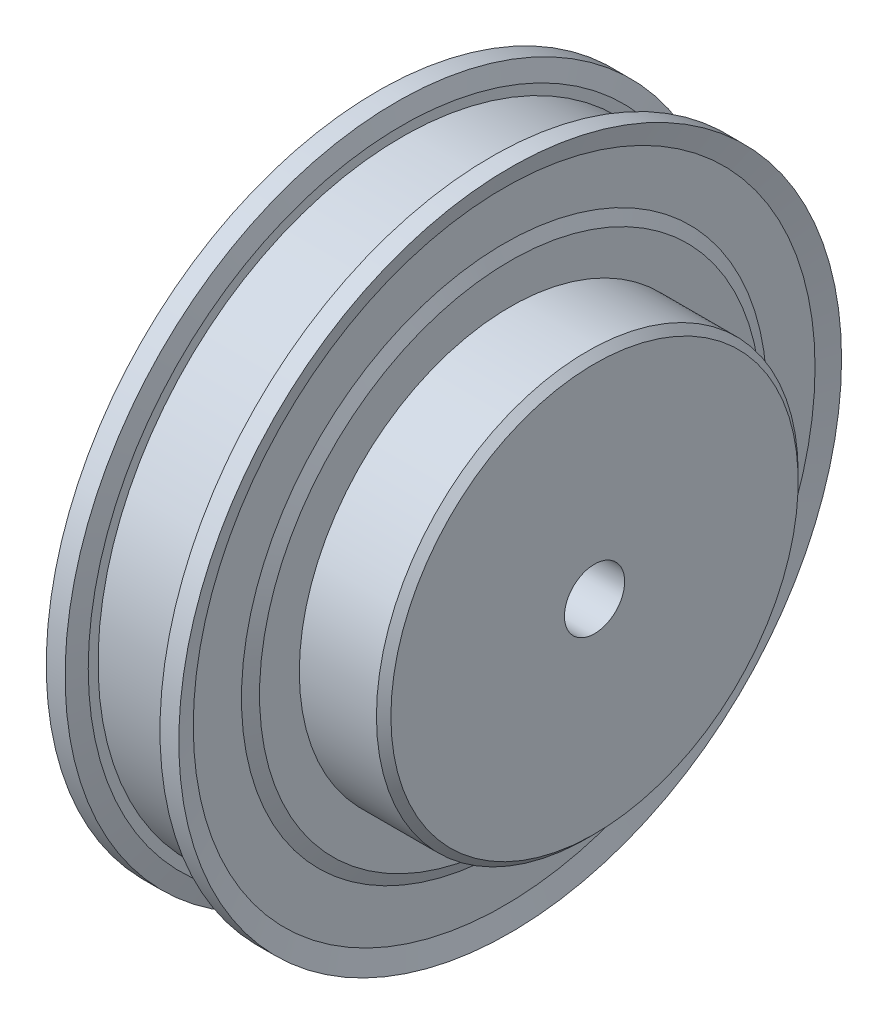
ISO-10303-21;
HEADER;
FILE_DESCRIPTION(('STEP AP214'),'2;1');
FILE_NAME('part.step','',(''),(''),'','','');
FILE_SCHEMA(('AUTOMOTIVE_DESIGN { 1 0 10303 214 1 1 1 1 }'));
ENDSEC;
DATA;
#1=APPLICATION_CONTEXT('core data for automotive mechanical design processes');
#2=APPLICATION_PROTOCOL_DEFINITION('international standard','automotive_design',2000,#1);
#3=PRODUCT_CONTEXT('',#1,'mechanical');
#4=PRODUCT('Part','Part','',(#3));
#5=PRODUCT_RELATED_PRODUCT_CATEGORY('part','',(#4));
#6=PRODUCT_DEFINITION_FORMATION('','',#4);
#7=PRODUCT_DEFINITION_CONTEXT('part definition',#1,'design');
#8=PRODUCT_DEFINITION('design','',#6,#7);
#9=PRODUCT_DEFINITION_SHAPE('','',#8);
#10=(LENGTH_UNIT() NAMED_UNIT(*) SI_UNIT(.MILLI.,.METRE.));
#11=(NAMED_UNIT(*) PLANE_ANGLE_UNIT() SI_UNIT($,.RADIAN.));
#12=(NAMED_UNIT(*) SI_UNIT($,.STERADIAN.) SOLID_ANGLE_UNIT());
#13=UNCERTAINTY_MEASURE_WITH_UNIT(LENGTH_MEASURE(1.E-05),#10,'distance_accuracy_value','');
#14=(GEOMETRIC_REPRESENTATION_CONTEXT(3) GLOBAL_UNCERTAINTY_ASSIGNED_CONTEXT((#13)) GLOBAL_UNIT_ASSIGNED_CONTEXT((#10,
#11,#12)) REPRESENTATION_CONTEXT('',''));
#15=CARTESIAN_POINT('',(0.,0.,0.));
#16=DIRECTION('',(0.,0.,1.));
#17=DIRECTION('',(1.,0.,0.));
#18=AXIS2_PLACEMENT_3D('',#15,#16,#17);
#19=CARTESIAN_POINT('',(5.65856270860032,0.8471223856294,132.089803738249));
#20=DIRECTION('',(-1.,0.,0.));
#21=DIRECTION('',(0.,0.,1.));
#22=AXIS2_PLACEMENT_3D('',#19,#20,#21);
#23=PLANE('',#22);
#24=CARTESIAN_POINT('',(5.65856270860058,0.847122385629351,110.289803738249));
#25=DIRECTION('',(-1.,0.,0.));
#26=DIRECTION('',(0.,0.,1.));
#27=AXIS2_PLACEMENT_3D('',#24,#25,#26);
#28=CIRCLE('',#27,21.8);
#29=CARTESIAN_POINT('',(5.65856270860085,0.847122385629303,88.4898037382492));
#30=VERTEX_POINT('',#29);
#31=EDGE_CURVE('E146',#30,#30,#28,.T.);
#32=ORIENTED_EDGE('',*,*,#31,.F.);
#33=EDGE_LOOP('',(#32));
#34=FACE_BOUND('',#33,.T.);
#35=CARTESIAN_POINT('',(5.65856270860063,0.847122385629351,110.289803738249));
#36=DIRECTION('',(-1.,0.,0.));
#37=DIRECTION('',(0.,0.,1.));
#38=AXIS2_PLACEMENT_3D('',#35,#36,#37);
#39=CIRCLE('',#38,25.8);
#40=CARTESIAN_POINT('',(5.65856270860095,0.847122385629294,84.4898037382493));
#41=VERTEX_POINT('',#40);
#42=EDGE_CURVE('E11',#41,#41,#39,.T.);
#43=ORIENTED_EDGE('',*,*,#42,.T.);
#44=EDGE_LOOP('',(#43));
#45=FACE_BOUND('',#44,.T.);
#46=ADVANCED_FACE('F17',(#34,#45),#23,.T.);
#47=CARTESIAN_POINT('',(5.40856270860064,0.847122385629351,110.289803738249));
#48=DIRECTION('',(-1.,0.,0.));
#49=DIRECTION('',(0.,0.,1.));
#50=AXIS2_PLACEMENT_3D('',#47,#48,#49);
#51=CONICAL_SURFACE('',#50,26.65,1.28474488507759);
#52=CARTESIAN_POINT('',(5.15856270860065,0.847122385629351,110.289803738249));
#53=DIRECTION('',(-1.,0.,0.));
#54=DIRECTION('',(0.,0.,1.));
#55=AXIS2_PLACEMENT_3D('',#52,#53,#54);
#56=CIRCLE('',#55,27.5);
#57=CARTESIAN_POINT('',(5.15856270860099,0.84712238562929,82.7898037382492));
#58=VERTEX_POINT('',#57);
#59=EDGE_CURVE('E147',#58,#58,#56,.T.);
#60=ORIENTED_EDGE('',*,*,#59,.T.);
#61=DIRECTION('',(0.282166323991525,0.,0.959365501571278));
#62=VECTOR('',#61,1.);
#63=CARTESIAN_POINT('',(5.40856270860097,0.847122385629292,83.6398037382492));
#64=LINE('',#63,#62);
#65=EDGE_CURVE('E28',#58,#41,#64,.T.);
#66=ORIENTED_EDGE('',*,*,#65,.T.);
#67=ORIENTED_EDGE('',*,*,#42,.F.);
#68=ORIENTED_EDGE('',*,*,#65,.F.);
#69=EDGE_LOOP('',(#60,#66,#67,#68));
#70=FACE_BOUND('',#69,.T.);
#71=ADVANCED_FACE('F321',(#70),#51,.F.);
#72=CARTESIAN_POINT('',(5.94032940624786,0.847122385629351,110.289803738249));
#73=DIRECTION('',(-1.,0.,0.));
#74=DIRECTION('',(0.,0.,1.));
#75=AXIS2_PLACEMENT_3D('',#72,#73,#74);
#76=CYLINDRICAL_SURFACE('',#75,27.5);
#77=ORIENTED_EDGE('',*,*,#59,.F.);
#78=DIRECTION('',(1.,0.,0.));
#79=VECTOR('',#78,1.);
#80=CARTESIAN_POINT('',(5.9403294062482,0.84712238562929,82.7898037382492));
#81=LINE('',#80,#79);
#82=CARTESIAN_POINT('',(6.72209610389541,0.84712238562929,82.7898037382492));
#83=VERTEX_POINT('',#82);
#84=EDGE_CURVE('E151',#58,#83,#81,.T.);
#85=ORIENTED_EDGE('',*,*,#84,.T.);
#86=CARTESIAN_POINT('',(6.72209610389507,0.847122385629351,110.289803738249));
#87=DIRECTION('',(-1.,0.,0.));
#88=DIRECTION('',(0.,0.,1.));
#89=AXIS2_PLACEMENT_3D('',#86,#87,#88);
#90=CIRCLE('',#89,27.5);
#91=EDGE_CURVE('E135',#83,#83,#90,.T.);
#92=ORIENTED_EDGE('',*,*,#91,.T.);
#93=ORIENTED_EDGE('',*,*,#84,.F.);
#94=EDGE_LOOP('',(#77,#85,#92,#93));
#95=FACE_BOUND('',#94,.T.);
#96=ADVANCED_FACE('F221',(#95),#76,.T.);
#97=CARTESIAN_POINT('',(6.94032940624787,0.847122385629351,110.289803738249));
#98=DIRECTION('',(-1.,0.,0.));
#99=DIRECTION('',(0.,0.,1.));
#100=AXIS2_PLACEMENT_3D('',#97,#98,#99);
#101=CONICAL_SURFACE('',#100,26.7580067720004,1.2847448850776);
#102=ORIENTED_EDGE('',*,*,#91,.F.);
#103=DIRECTION('',(0.282166323991517,0.,0.95936550157128));
#104=VECTOR('',#103,1.);
#105=CARTESIAN_POINT('',(6.9403294062482,0.847122385629292,83.5317969662488));
#106=LINE('',#105,#104);
#107=CARTESIAN_POINT('',(7.158562708601,0.847122385629293,84.2737901942485));
#108=VERTEX_POINT('',#107);
#109=EDGE_CURVE('E139',#83,#108,#106,.T.);
#110=ORIENTED_EDGE('',*,*,#109,.T.);
#111=CARTESIAN_POINT('',(7.15856270860068,0.847122385629351,110.289803738249));
#112=DIRECTION('',(-1.,0.,0.));
#113=DIRECTION('',(0.,0.,1.));
#114=AXIS2_PLACEMENT_3D('',#111,#112,#113);
#115=CIRCLE('',#114,26.0160135440008);
#116=EDGE_CURVE('E140',#108,#108,#115,.T.);
#117=ORIENTED_EDGE('',*,*,#116,.T.);
#118=ORIENTED_EDGE('',*,*,#109,.F.);
#119=EDGE_LOOP('',(#102,#110,#117,#118));
#120=FACE_BOUND('',#119,.T.);
#121=ADVANCED_FACE('F224',(#120),#101,.T.);
#122=CARTESIAN_POINT('',(7.15856270860036,0.8471223856294,136.30581728225));
#123=DIRECTION('',(1.,0.,0.));
#124=DIRECTION('',(0.,0.,1.));
#125=AXIS2_PLACEMENT_3D('',#122,#123,#124);
#126=PLANE('',#125);
#127=CARTESIAN_POINT('',(7.15856270860063,0.847122385629351,110.289803738249));
#128=DIRECTION('',(-1.,0.,0.));
#129=DIRECTION('',(0.,0.,1.));
#130=AXIS2_PLACEMENT_3D('',#127,#128,#129);
#131=CIRCLE('',#130,25.2);
#132=CARTESIAN_POINT('',(7.15856270860094,0.847122385629295,85.0898037382493));
#133=VERTEX_POINT('',#132);
#134=EDGE_CURVE('E177',#133,#133,#131,.T.);
#135=ORIENTED_EDGE('',*,*,#134,.T.);
#136=EDGE_LOOP('',(#135));
#137=FACE_BOUND('',#136,.T.);
#138=ORIENTED_EDGE('',*,*,#116,.F.);
#139=EDGE_LOOP('',(#138));
#140=FACE_BOUND('',#139,.T.);
#141=ADVANCED_FACE('F268',(#137,#140),#126,.T.);
#142=CARTESIAN_POINT('',(10.6585627086023,0.847122385629351,110.289803738249));
#143=DIRECTION('',(-1.,0.,0.));
#144=DIRECTION('',(0.,0.,1.));
#145=AXIS2_PLACEMENT_3D('',#142,#143,#144);
#146=CYLINDRICAL_SURFACE('',#145,25.2);
#147=ORIENTED_EDGE('',*,*,#134,.F.);
#148=DIRECTION('',(1.,0.,0.));
#149=VECTOR('',#148,1.);
#150=CARTESIAN_POINT('',(10.6585627086026,0.847122385629295,85.0898037382493));
#151=LINE('',#150,#149);
#152=CARTESIAN_POINT('',(14.1585627086042,0.847122385629295,85.0898037382494));
#153=VERTEX_POINT('',#152);
#154=EDGE_CURVE('E155',#133,#153,#151,.T.);
#155=ORIENTED_EDGE('',*,*,#154,.T.);
#156=CARTESIAN_POINT('',(14.1585627086039,0.847122385629351,110.289803738249));
#157=DIRECTION('',(-1.,0.,0.));
#158=DIRECTION('',(0.,0.,1.));
#159=AXIS2_PLACEMENT_3D('',#156,#157,#158);
#160=CIRCLE('',#159,25.2);
#161=EDGE_CURVE('E175',#153,#153,#160,.T.);
#162=ORIENTED_EDGE('',*,*,#161,.T.);
#163=ORIENTED_EDGE('',*,*,#154,.F.);
#164=EDGE_LOOP('',(#147,#155,#162,#163));
#165=FACE_BOUND('',#164,.T.);
#166=ADVANCED_FACE('F273',(#165),#146,.T.);
#167=CARTESIAN_POINT('',(14.1585627086036,0.8471223856294,135.489803738249));
#168=DIRECTION('',(-1.,0.,0.));
#169=DIRECTION('',(0.,0.,1.));
#170=AXIS2_PLACEMENT_3D('',#167,#168,#169);
#171=PLANE('',#170);
#172=ORIENTED_EDGE('',*,*,#161,.F.);
#173=EDGE_LOOP('',(#172));
#174=FACE_BOUND('',#173,.T.);
#175=CARTESIAN_POINT('',(14.158562708604,0.847122385629351,110.289803738249));
#176=DIRECTION('',(-1.,0.,0.));
#177=DIRECTION('',(0.,0.,1.));
#178=AXIS2_PLACEMENT_3D('',#175,#176,#177);
#179=CIRCLE('',#178,26.0160135440007);
#180=CARTESIAN_POINT('',(14.1585627086044,0.847122385629293,84.2737901942486));
#181=VERTEX_POINT('',#180);
#182=EDGE_CURVE('E176',#181,#181,#179,.T.);
#183=ORIENTED_EDGE('',*,*,#182,.T.);
#184=EDGE_LOOP('',(#183));
#185=FACE_BOUND('',#184,.T.);
#186=ADVANCED_FACE('F281',(#174,#185),#171,.T.);
#187=CARTESIAN_POINT('',(14.3767960109555,0.847122385629351,110.289803738249));
#188=DIRECTION('',(1.,0.,0.));
#189=DIRECTION('',(0.,0.,1.));
#190=AXIS2_PLACEMENT_3D('',#187,#188,#189);
#191=CONICAL_SURFACE('',#190,26.7580067720003,1.28474488507932);
#192=ORIENTED_EDGE('',*,*,#182,.F.);
#193=DIRECTION('',(0.282166323989891,0.,-0.959365501571759));
#194=VECTOR('',#193,1.);
#195=CARTESIAN_POINT('',(14.3767960109558,0.847122385629292,83.531796966249));
#196=LINE('',#195,#194);
#197=CARTESIAN_POINT('',(14.5950293133072,0.84712238562929,82.7898037382495));
#198=VERTEX_POINT('',#197);
#199=EDGE_CURVE('E173',#181,#198,#196,.T.);
#200=ORIENTED_EDGE('',*,*,#199,.T.);
#201=CARTESIAN_POINT('',(14.5950293133069,0.847122385629351,110.289803738249));
#202=DIRECTION('',(-1.,0.,0.));
#203=DIRECTION('',(0.,0.,1.));
#204=AXIS2_PLACEMENT_3D('',#201,#202,#203);
#205=CIRCLE('',#204,27.5);
#206=EDGE_CURVE('E163',#198,#198,#205,.T.);
#207=ORIENTED_EDGE('',*,*,#206,.T.);
#208=ORIENTED_EDGE('',*,*,#199,.F.);
#209=EDGE_LOOP('',(#192,#200,#207,#208));
#210=FACE_BOUND('',#209,.T.);
#211=ADVANCED_FACE('F289',(#210),#191,.T.);
#212=CARTESIAN_POINT('',(15.3767960109538,0.847122385629351,110.289803738249));
#213=DIRECTION('',(-1.,0.,0.));
#214=DIRECTION('',(0.,0.,1.));
#215=AXIS2_PLACEMENT_3D('',#212,#213,#214);
#216=CYLINDRICAL_SURFACE('',#215,27.5);
#217=ORIENTED_EDGE('',*,*,#206,.F.);
#218=DIRECTION('',(1.,0.,0.));
#219=VECTOR('',#218,1.);
#220=CARTESIAN_POINT('',(15.3767960109541,0.84712238562929,82.7898037382495));
#221=LINE('',#220,#219);
#222=CARTESIAN_POINT('',(16.158562708601,0.84712238562929,82.7898037382495));
#223=VERTEX_POINT('',#222);
#224=EDGE_CURVE('E213',#198,#223,#221,.T.);
#225=ORIENTED_EDGE('',*,*,#224,.T.);
#226=CARTESIAN_POINT('',(16.1585627086007,0.847122385629351,110.289803738249));
#227=DIRECTION('',(-1.,0.,0.));
#228=DIRECTION('',(0.,0.,1.));
#229=AXIS2_PLACEMENT_3D('',#226,#227,#228);
#230=CIRCLE('',#229,27.5);
#231=EDGE_CURVE('E159',#223,#223,#230,.T.);
#232=ORIENTED_EDGE('',*,*,#231,.T.);
#233=ORIENTED_EDGE('',*,*,#224,.F.);
#234=EDGE_LOOP('',(#217,#225,#232,#233));
#235=FACE_BOUND('',#234,.T.);
#236=ADVANCED_FACE('F249',(#235),#216,.T.);
#237=CARTESIAN_POINT('',(15.9085627086023,0.847122385629351,110.289803738249));
#238=DIRECTION('',(1.,0.,0.));
#239=DIRECTION('',(0.,0.,1.));
#240=AXIS2_PLACEMENT_3D('',#237,#238,#239);
#241=CONICAL_SURFACE('',#240,26.65,1.28474488507932);
#242=CARTESIAN_POINT('',(15.6585627086039,0.847122385629351,110.289803738249));
#243=DIRECTION('',(-1.,0.,0.));
#244=DIRECTION('',(0.,0.,1.));
#245=AXIS2_PLACEMENT_3D('',#242,#243,#244);
#246=CIRCLE('',#245,25.8);
#247=CARTESIAN_POINT('',(15.6585627086042,0.847122385629294,84.4898037382495));
#248=VERTEX_POINT('',#247);
#249=EDGE_CURVE('E165',#248,#248,#246,.T.);
#250=ORIENTED_EDGE('',*,*,#249,.T.);
#251=DIRECTION('',(0.282166323989894,0.,-0.959365501571758));
#252=VECTOR('',#251,1.);
#253=CARTESIAN_POINT('',(15.9085627086026,0.847122385629292,83.6398037382495));
#254=LINE('',#253,#252);
#255=EDGE_CURVE('E164',#248,#223,#254,.T.);
#256=ORIENTED_EDGE('',*,*,#255,.T.);
#257=ORIENTED_EDGE('',*,*,#231,.F.);
#258=ORIENTED_EDGE('',*,*,#255,.F.);
#259=EDGE_LOOP('',(#250,#256,#257,#258));
#260=FACE_BOUND('',#259,.T.);
#261=ADVANCED_FACE('F19',(#260),#241,.F.);
#262=CARTESIAN_POINT('',(15.6585627086036,0.8471223856294,136.089803738249));
#263=DIRECTION('',(1.,0.,0.));
#264=DIRECTION('',(0.,0.,1.));
#265=AXIS2_PLACEMENT_3D('',#262,#263,#264);
#266=PLANE('',#265);
#267=CARTESIAN_POINT('',(15.6585627086031,0.847122385629351,110.289803738249));
#268=DIRECTION('',(-1.,0.,0.));
#269=DIRECTION('',(0.,0.,1.));
#270=AXIS2_PLACEMENT_3D('',#267,#268,#269);
#271=CIRCLE('',#270,21.8);
#272=CARTESIAN_POINT('',(15.6585627086034,0.847122385629303,88.4898037382495));
#273=VERTEX_POINT('',#272);
#274=EDGE_CURVE('E200',#273,#273,#271,.T.);
#275=ORIENTED_EDGE('',*,*,#274,.T.);
#276=EDGE_LOOP('',(#275));
#277=FACE_BOUND('',#276,.T.);
#278=ORIENTED_EDGE('',*,*,#249,.F.);
#279=EDGE_LOOP('',(#278));
#280=FACE_BOUND('',#279,.T.);
#281=ADVANCED_FACE('F262',(#277,#280),#266,.T.);
#282=CARTESIAN_POINT('',(15.9085627086019,0.847122385629351,110.289803738249));
#283=DIRECTION('',(-1.,0.,0.));
#284=DIRECTION('',(0.,0.,1.));
#285=AXIS2_PLACEMENT_3D('',#282,#283,#284);
#286=CONICAL_SURFACE('',#285,21.3,1.10714871779613);
#287=ORIENTED_EDGE('',*,*,#274,.F.);
#288=DIRECTION('',(0.447213595498118,0.,0.894427191000836));
#289=VECTOR('',#288,1.);
#290=CARTESIAN_POINT('',(15.9085627086021,0.847122385629304,88.9898037382495));
#291=LINE('',#290,#289);
#292=CARTESIAN_POINT('',(16.1585627086008,0.847122385629305,89.4898037382495));
#293=VERTEX_POINT('',#292);
#294=EDGE_CURVE('E169',#273,#293,#291,.T.);
#295=ORIENTED_EDGE('',*,*,#294,.T.);
#296=CARTESIAN_POINT('',(16.1585627086006,0.847122385629351,110.289803738249));
#297=DIRECTION('',(-1.,0.,0.));
#298=DIRECTION('',(0.,0.,1.));
#299=AXIS2_PLACEMENT_3D('',#296,#297,#298);
#300=CIRCLE('',#299,20.8);
#301=EDGE_CURVE('E196',#293,#293,#300,.T.);
#302=ORIENTED_EDGE('',*,*,#301,.T.);
#303=ORIENTED_EDGE('',*,*,#294,.F.);
#304=EDGE_LOOP('',(#287,#295,#302,#303));
#305=FACE_BOUND('',#304,.T.);
#306=ADVANCED_FACE('F353',(#305),#286,.T.);
#307=CARTESIAN_POINT('',(16.1585627086003,0.8471223856294,131.089803738249));
#308=DIRECTION('',(1.,0.,0.));
#309=DIRECTION('',(0.,0.,1.));
#310=AXIS2_PLACEMENT_3D('',#307,#308,#309);
#311=PLANE('',#310);
#312=CARTESIAN_POINT('',(16.1585627086005,0.847122385629351,110.289803738249));
#313=DIRECTION('',(-1.,0.,0.));
#314=DIRECTION('',(0.,0.,1.));
#315=AXIS2_PLACEMENT_3D('',#312,#313,#314);
#316=CIRCLE('',#315,17.5);
#317=CARTESIAN_POINT('',(16.1585627086008,0.847122385629312,92.7898037382494));
#318=VERTEX_POINT('',#317);
#319=EDGE_CURVE('E124',#318,#318,#316,.T.);
#320=ORIENTED_EDGE('',*,*,#319,.T.);
#321=EDGE_LOOP('',(#320));
#322=FACE_BOUND('',#321,.T.);
#323=ORIENTED_EDGE('',*,*,#301,.F.);
#324=EDGE_LOOP('',(#323));
#325=FACE_BOUND('',#324,.T.);
#326=ADVANCED_FACE('F347',(#322,#325),#311,.T.);
#327=CARTESIAN_POINT('',(14.1585627086003,0.847122385629351,110.289803738249));
#328=DIRECTION('',(-1.,0.,0.));
#329=DIRECTION('',(0.,0.,1.));
#330=AXIS2_PLACEMENT_3D('',#327,#328,#329);
#331=CYLINDRICAL_SURFACE('',#330,2.49999999999988);
#332=CARTESIAN_POINT('',(5.15856270860035,0.847122385629351,110.289803738249));
#333=DIRECTION('',(-1.,0.,0.));
#334=DIRECTION('',(0.,0.,1.));
#335=AXIS2_PLACEMENT_3D('',#332,#333,#334);
#336=CIRCLE('',#335,2.5);
#337=CARTESIAN_POINT('',(5.15856270860038,0.847122385629345,107.789803738249));
#338=VERTEX_POINT('',#337);
#339=EDGE_CURVE('E141',#338,#338,#336,.T.);
#340=ORIENTED_EDGE('',*,*,#339,.T.);
#341=DIRECTION('',(1.,0.,0.));
#342=VECTOR('',#341,1.);
#343=CARTESIAN_POINT('',(14.1585627086004,0.847122385629345,107.789803738249));
#344=LINE('',#343,#342);
#345=CARTESIAN_POINT('',(23.1585627086004,0.847122385629345,107.78980373825));
#346=VERTEX_POINT('',#345);
#347=EDGE_CURVE('E145',#338,#346,#344,.T.);
#348=ORIENTED_EDGE('',*,*,#347,.T.);
#349=CARTESIAN_POINT('',(23.1585627086003,0.847122385629351,110.289803738249));
#350=DIRECTION('',(-1.,0.,0.));
#351=DIRECTION('',(0.,0.,1.));
#352=AXIS2_PLACEMENT_3D('',#349,#350,#351);
#353=CIRCLE('',#352,2.49999999999977);
#354=EDGE_CURVE('E116',#346,#346,#353,.T.);
#355=ORIENTED_EDGE('',*,*,#354,.F.);
#356=ORIENTED_EDGE('',*,*,#347,.F.);
#357=EDGE_LOOP('',(#340,#348,#355,#356));
#358=FACE_BOUND('',#357,.T.);
#359=ADVANCED_FACE('F338',(#358),#331,.F.);
#360=CARTESIAN_POINT('',(5.15856270860032,0.8471223856294,112.789803738249));
#361=DIRECTION('',(-1.,0.,0.));
#362=DIRECTION('',(0.,0.,1.));
#363=AXIS2_PLACEMENT_3D('',#360,#361,#362);
#364=PLANE('',#363);
#365=ORIENTED_EDGE('',*,*,#339,.F.);
#366=EDGE_LOOP('',(#365));
#367=FACE_BOUND('',#366,.T.);
#368=CARTESIAN_POINT('',(5.15856270860057,0.847122385629351,110.289803738249));
#369=DIRECTION('',(-1.,0.,0.));
#370=DIRECTION('',(0.,0.,1.));
#371=AXIS2_PLACEMENT_3D('',#368,#369,#370);
#372=CIRCLE('',#371,20.8);
#373=CARTESIAN_POINT('',(5.15856270860082,0.847122385629305,89.4898037382492));
#374=VERTEX_POINT('',#373);
#375=EDGE_CURVE('E207',#374,#374,#372,.T.);
#376=ORIENTED_EDGE('',*,*,#375,.T.);
#377=EDGE_LOOP('',(#376));
#378=FACE_BOUND('',#377,.T.);
#379=ADVANCED_FACE('F310',(#367,#378),#364,.T.);
#380=CARTESIAN_POINT('',(5.40856270860058,0.847122385629351,110.289803738249));
#381=DIRECTION('',(1.,0.,0.));
#382=DIRECTION('',(0.,0.,1.));
#383=AXIS2_PLACEMENT_3D('',#380,#381,#382);
#384=CONICAL_SURFACE('',#383,21.3,1.10714871779408);
#385=ORIENTED_EDGE('',*,*,#375,.F.);
#386=DIRECTION('',(0.44721359549998,0.,-0.894427190999905));
#387=VECTOR('',#386,1.);
#388=CARTESIAN_POINT('',(5.40856270860084,0.847122385629304,88.9898037382492));
#389=LINE('',#388,#387);
#390=EDGE_CURVE('E129',#374,#30,#389,.T.);
#391=ORIENTED_EDGE('',*,*,#390,.T.);
#392=ORIENTED_EDGE('',*,*,#31,.T.);
#393=ORIENTED_EDGE('',*,*,#390,.F.);
#394=EDGE_LOOP('',(#385,#391,#392,#393));
#395=FACE_BOUND('',#394,.T.);
#396=ADVANCED_FACE('F304',(#395),#384,.T.);
#397=CARTESIAN_POINT('',(19.6585627086005,0.847122385629351,110.289803738249));
#398=DIRECTION('',(-1.,0.,0.));
#399=DIRECTION('',(0.,0.,1.));
#400=AXIS2_PLACEMENT_3D('',#397,#398,#399);
#401=CYLINDRICAL_SURFACE('',#400,17.5);
#402=ORIENTED_EDGE('',*,*,#319,.F.);
#403=DIRECTION('',(1.,0.,0.));
#404=VECTOR('',#403,1.);
#405=CARTESIAN_POINT('',(19.6585627086007,0.847122385629312,92.7898037382495));
#406=LINE('',#405,#404);
#407=CARTESIAN_POINT('',(22.5585627086007,0.847122385629312,92.7898037382495));
#408=VERTEX_POINT('',#407);
#409=EDGE_CURVE('E134',#318,#408,#406,.T.);
#410=ORIENTED_EDGE('',*,*,#409,.T.);
#411=CARTESIAN_POINT('',(22.5585627086005,0.847122385629351,110.289803738249));
#412=DIRECTION('',(1.,0.,0.));
#413=DIRECTION('',(0.,0.,-1.));
#414=AXIS2_PLACEMENT_3D('',#411,#412,#413);
#415=CIRCLE('',#414,17.5);
#416=CARTESIAN_POINT('',(22.5585627086003,0.847122385629385,127.789803738249));
#417=VERTEX_POINT('',#416);
#418=EDGE_CURVE('E170',#417,#408,#415,.T.);
#419=ORIENTED_EDGE('',*,*,#418,.F.);
#420=CARTESIAN_POINT('',(22.5585627086005,0.847122385629351,110.289803738249));
#421=DIRECTION('',(1.,0.,0.));
#422=DIRECTION('',(0.,0.,-1.));
#423=AXIS2_PLACEMENT_3D('',#420,#421,#422);
#424=CIRCLE('',#423,17.5);
#425=EDGE_CURVE('E21',#408,#417,#424,.T.);
#426=ORIENTED_EDGE('',*,*,#425,.F.);
#427=ORIENTED_EDGE('',*,*,#409,.F.);
#428=EDGE_LOOP('',(#402,#410,#419,#426,#427));
#429=FACE_BOUND('',#428,.T.);
#430=ADVANCED_FACE('F309',(#429),#401,.T.);
#431=CARTESIAN_POINT('',(23.1585627086003,0.8471223856294,127.789803738249));
#432=DIRECTION('',(1.,0.,0.));
#433=DIRECTION('',(0.,0.,1.));
#434=AXIS2_PLACEMENT_3D('',#431,#432,#433);
#435=PLANE('',#434);
#436=ORIENTED_EDGE('',*,*,#354,.T.);
#437=EDGE_LOOP('',(#436));
#438=FACE_BOUND('',#437,.T.);
#439=CARTESIAN_POINT('',(23.1585627086005,0.847122385629351,110.289803738249));
#440=DIRECTION('',(-1.,0.,0.));
#441=DIRECTION('',(0.,0.,-1.));
#442=AXIS2_PLACEMENT_3D('',#439,#440,#441);
#443=CIRCLE('',#442,16.9);
#444=CARTESIAN_POINT('',(23.1585627086003,0.847122385629388,127.189803738249));
#445=VERTEX_POINT('',#444);
#446=EDGE_CURVE('E109',#445,#445,#443,.T.);
#447=ORIENTED_EDGE('',*,*,#446,.F.);
#448=EDGE_LOOP('',(#447));
#449=FACE_BOUND('',#448,.T.);
#450=ADVANCED_FACE('F299',(#438,#449),#435,.T.);
#451=CARTESIAN_POINT('',(22.8585627086005,0.847122385629351,110.289803738249));
#452=DIRECTION('',(-1.,0.,0.));
#453=DIRECTION('',(0.,0.,-1.));
#454=AXIS2_PLACEMENT_3D('',#451,#452,#453);
#455=CONICAL_SURFACE('',#454,17.2,0.785398163397574);
#456=ORIENTED_EDGE('',*,*,#418,.T.);
#457=ORIENTED_EDGE('',*,*,#425,.T.);
#458=DIRECTION('',(0.707106781186459,0.,-0.707106781186636));
#459=VECTOR('',#458,1.);
#460=CARTESIAN_POINT('',(22.8585627086003,0.847122385629389,127.489803738249));
#461=LINE('',#460,#459);
#462=EDGE_CURVE('E112',#417,#445,#461,.T.);
#463=ORIENTED_EDGE('',*,*,#462,.T.);
#464=ORIENTED_EDGE('',*,*,#446,.T.);
#465=ORIENTED_EDGE('',*,*,#462,.F.);
#466=EDGE_LOOP('',(#456,#457,#463,#464,#465));
#467=FACE_BOUND('',#466,.T.);
#468=ADVANCED_FACE('F111',(#467),#455,.T.);
#469=CLOSED_SHELL('',(#46,#71,#96,#121,#141,#166,#186,#211,#236,#261,#281,#306,#326,#359,#379,
#396,#430,#450,#468));
#470=MANIFOLD_SOLID_BREP('B1',#469);
#471=ADVANCED_BREP_SHAPE_REPRESENTATION('',(#18,#470),#14);
#472=SHAPE_DEFINITION_REPRESENTATION(#9,#471);
ENDSEC;
END-ISO-10303-21;
